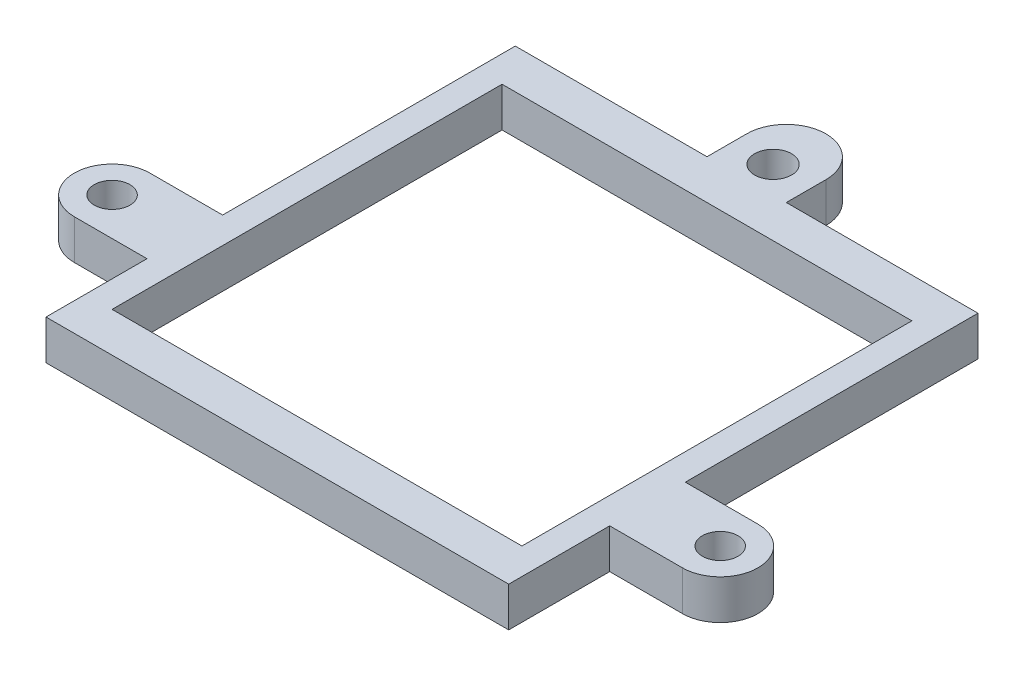
ISO-10303-21;
HEADER;
FILE_DESCRIPTION(('STEP AP214'),'2;1');
FILE_NAME('part.step','',(''),(''),'','','');
FILE_SCHEMA(('AUTOMOTIVE_DESIGN { 1 0 10303 214 1 1 1 1 }'));
ENDSEC;
DATA;
#1=APPLICATION_CONTEXT('core data for automotive mechanical design processes');
#2=APPLICATION_PROTOCOL_DEFINITION('international standard','automotive_design',2000,#1);
#3=PRODUCT_CONTEXT('',#1,'mechanical');
#4=PRODUCT('Part','Part','',(#3));
#5=PRODUCT_RELATED_PRODUCT_CATEGORY('part','',(#4));
#6=PRODUCT_DEFINITION_FORMATION('','',#4);
#7=PRODUCT_DEFINITION_CONTEXT('part definition',#1,'design');
#8=PRODUCT_DEFINITION('design','',#6,#7);
#9=PRODUCT_DEFINITION_SHAPE('','',#8);
#10=(LENGTH_UNIT() NAMED_UNIT(*) SI_UNIT(.MILLI.,.METRE.));
#11=(NAMED_UNIT(*) PLANE_ANGLE_UNIT() SI_UNIT($,.RADIAN.));
#12=(NAMED_UNIT(*) SI_UNIT($,.STERADIAN.) SOLID_ANGLE_UNIT());
#13=UNCERTAINTY_MEASURE_WITH_UNIT(LENGTH_MEASURE(1.E-05),#10,'distance_accuracy_value','');
#14=(GEOMETRIC_REPRESENTATION_CONTEXT(3) GLOBAL_UNCERTAINTY_ASSIGNED_CONTEXT((#13)) GLOBAL_UNIT_ASSIGNED_CONTEXT((#10,
#11,#12)) REPRESENTATION_CONTEXT('',''));
#15=CARTESIAN_POINT('',(0.,0.,0.));
#16=DIRECTION('',(0.,0.,1.));
#17=DIRECTION('',(1.,0.,0.));
#18=AXIS2_PLACEMENT_3D('',#15,#16,#17);
#19=CARTESIAN_POINT('',(0.,3.,-14.75));
#20=DIRECTION('',(0.,0.,-1.));
#21=DIRECTION('',(-1.,0.,0.));
#22=AXIS2_PLACEMENT_3D('',#19,#20,#21);
#23=PLANE('',#22);
#24=DIRECTION('',(1.,0.,0.));
#25=VECTOR('',#24,1.);
#26=CARTESIAN_POINT('',(0.,0.,-14.75));
#27=LINE('',#26,#25);
#28=CARTESIAN_POINT('',(-15.5,0.,-14.75));
#29=VERTEX_POINT('',#28);
#30=CARTESIAN_POINT('',(15.5,0.,-14.75));
#31=VERTEX_POINT('',#30);
#32=EDGE_CURVE('E257',#29,#31,#27,.T.);
#33=ORIENTED_EDGE('',*,*,#32,.T.);
#34=DIRECTION('',(0.,-1.,0.));
#35=VECTOR('',#34,1.);
#36=CARTESIAN_POINT('',(15.5,3.,-14.75));
#37=LINE('',#36,#35);
#38=CARTESIAN_POINT('',(15.5,3.,-14.75));
#39=VERTEX_POINT('',#38);
#40=EDGE_CURVE('E11',#39,#31,#37,.T.);
#41=ORIENTED_EDGE('',*,*,#40,.F.);
#42=DIRECTION('',(1.,0.,0.));
#43=VECTOR('',#42,1.);
#44=CARTESIAN_POINT('',(0.,3.,-14.75));
#45=LINE('',#44,#43);
#46=CARTESIAN_POINT('',(-15.5,3.,-14.75));
#47=VERTEX_POINT('',#46);
#48=EDGE_CURVE('E189',#47,#39,#45,.T.);
#49=ORIENTED_EDGE('',*,*,#48,.F.);
#50=DIRECTION('',(0.,-1.,0.));
#51=VECTOR('',#50,1.);
#52=CARTESIAN_POINT('',(-15.5,3.,-14.75));
#53=LINE('',#52,#51);
#54=EDGE_CURVE('E56',#47,#29,#53,.T.);
#55=ORIENTED_EDGE('',*,*,#54,.T.);
#56=EDGE_LOOP('',(#33,#41,#49,#55));
#57=FACE_BOUND('',#56,.T.);
#58=ADVANCED_FACE('F37',(#57),#23,.F.);
#59=CARTESIAN_POINT('',(15.5,3.,0.));
#60=DIRECTION('',(1.,0.,0.));
#61=DIRECTION('',(0.,0.,-1.));
#62=AXIS2_PLACEMENT_3D('',#59,#60,#61);
#63=PLANE('',#62);
#64=DIRECTION('',(0.,0.,1.));
#65=VECTOR('',#64,1.);
#66=CARTESIAN_POINT('',(15.5,0.,0.));
#67=LINE('',#66,#65);
#68=CARTESIAN_POINT('',(15.5,0.,14.75));
#69=VERTEX_POINT('',#68);
#70=EDGE_CURVE('E195',#31,#69,#67,.T.);
#71=ORIENTED_EDGE('',*,*,#70,.T.);
#72=DIRECTION('',(0.,-1.,0.));
#73=VECTOR('',#72,1.);
#74=CARTESIAN_POINT('',(15.5,3.,14.75));
#75=LINE('',#74,#73);
#76=CARTESIAN_POINT('',(15.5,3.,14.75));
#77=VERTEX_POINT('',#76);
#78=EDGE_CURVE('E47',#77,#69,#75,.T.);
#79=ORIENTED_EDGE('',*,*,#78,.F.);
#80=DIRECTION('',(0.,0.,1.));
#81=VECTOR('',#80,1.);
#82=CARTESIAN_POINT('',(15.5,3.,0.));
#83=LINE('',#82,#81);
#84=EDGE_CURVE('E182',#39,#77,#83,.T.);
#85=ORIENTED_EDGE('',*,*,#84,.F.);
#86=ORIENTED_EDGE('',*,*,#40,.T.);
#87=EDGE_LOOP('',(#71,#79,#85,#86));
#88=FACE_BOUND('',#87,.T.);
#89=ADVANCED_FACE('F194',(#88),#63,.F.);
#90=CARTESIAN_POINT('',(0.,3.,14.75));
#91=DIRECTION('',(0.,0.,-1.));
#92=DIRECTION('',(-1.,0.,0.));
#93=AXIS2_PLACEMENT_3D('',#90,#91,#92);
#94=PLANE('',#93);
#95=DIRECTION('',(1.,0.,0.));
#96=VECTOR('',#95,1.);
#97=CARTESIAN_POINT('',(0.,0.,14.75));
#98=LINE('',#97,#96);
#99=CARTESIAN_POINT('',(-15.5,0.,14.75));
#100=VERTEX_POINT('',#99);
#101=EDGE_CURVE('E260',#100,#69,#98,.T.);
#102=ORIENTED_EDGE('',*,*,#101,.F.);
#103=DIRECTION('',(0.,-1.,0.));
#104=VECTOR('',#103,1.);
#105=CARTESIAN_POINT('',(-15.5,3.,14.75));
#106=LINE('',#105,#104);
#107=CARTESIAN_POINT('',(-15.5,3.,14.75));
#108=VERTEX_POINT('',#107);
#109=EDGE_CURVE('E118',#108,#100,#106,.T.);
#110=ORIENTED_EDGE('',*,*,#109,.F.);
#111=DIRECTION('',(1.,0.,0.));
#112=VECTOR('',#111,1.);
#113=CARTESIAN_POINT('',(0.,3.,14.75));
#114=LINE('',#113,#112);
#115=EDGE_CURVE('E188',#108,#77,#114,.T.);
#116=ORIENTED_EDGE('',*,*,#115,.T.);
#117=ORIENTED_EDGE('',*,*,#78,.T.);
#118=EDGE_LOOP('',(#102,#110,#116,#117));
#119=FACE_BOUND('',#118,.T.);
#120=ADVANCED_FACE('F199',(#119),#94,.T.);
#121=CARTESIAN_POINT('',(-23.,3.,7.25));
#122=DIRECTION('',(0.,-1.,0.));
#123=DIRECTION('',(0.,0.,-1.));
#124=AXIS2_PLACEMENT_3D('',#121,#122,#123);
#125=CYLINDRICAL_SURFACE('',#124,2.86011574085284);
#126=CARTESIAN_POINT('',(-23.,0.,7.25));
#127=DIRECTION('',(0.,1.,0.));
#128=DIRECTION('',(0.,0.,1.));
#129=AXIS2_PLACEMENT_3D('',#126,#127,#128);
#130=CIRCLE('',#129,2.86011574085284);
#131=CARTESIAN_POINT('',(-23.,0.,10.1101157408528));
#132=VERTEX_POINT('',#131);
#133=CARTESIAN_POINT('',(-23.,0.,4.38988425914716));
#134=VERTEX_POINT('',#133);
#135=EDGE_CURVE('E215',#132,#134,#130,.F.);
#136=ORIENTED_EDGE('',*,*,#135,.F.);
#137=DIRECTION('',(0.,-1.,0.));
#138=VECTOR('',#137,1.);
#139=CARTESIAN_POINT('',(-23.,3.,10.1101157408528));
#140=LINE('',#139,#138);
#141=CARTESIAN_POINT('',(-23.,3.,10.1101157408528));
#142=VERTEX_POINT('',#141);
#143=EDGE_CURVE('E41',#142,#132,#140,.T.);
#144=ORIENTED_EDGE('',*,*,#143,.F.);
#145=CARTESIAN_POINT('',(-23.,3.,7.25));
#146=DIRECTION('',(0.,1.,0.));
#147=DIRECTION('',(0.,0.,1.));
#148=AXIS2_PLACEMENT_3D('',#145,#146,#147);
#149=CIRCLE('',#148,2.86011574085284);
#150=CARTESIAN_POINT('',(-23.,3.,4.38988425914716));
#151=VERTEX_POINT('',#150);
#152=EDGE_CURVE('E332',#142,#151,#149,.F.);
#153=ORIENTED_EDGE('',*,*,#152,.T.);
#154=DIRECTION('',(0.,-1.,0.));
#155=VECTOR('',#154,1.);
#156=CARTESIAN_POINT('',(-23.,3.,4.38988425914716));
#157=LINE('',#156,#155);
#158=EDGE_CURVE('E211',#151,#134,#157,.T.);
#159=ORIENTED_EDGE('',*,*,#158,.T.);
#160=EDGE_LOOP('',(#136,#144,#153,#159));
#161=FACE_BOUND('',#160,.T.);
#162=ADVANCED_FACE('F312',(#161),#125,.T.);
#163=CARTESIAN_POINT('',(0.,3.,10.1101157408528));
#164=DIRECTION('',(0.,0.,1.));
#165=DIRECTION('',(1.,0.,0.));
#166=AXIS2_PLACEMENT_3D('',#163,#164,#165);
#167=PLANE('',#166);
#168=DIRECTION('',(-1.,0.,0.));
#169=VECTOR('',#168,1.);
#170=CARTESIAN_POINT('',(0.,0.,10.1101157408528));
#171=LINE('',#170,#169);
#172=CARTESIAN_POINT('',(-17.5,0.,10.1101157408528));
#173=VERTEX_POINT('',#172);
#174=EDGE_CURVE('E218',#173,#132,#171,.T.);
#175=ORIENTED_EDGE('',*,*,#174,.F.);
#176=DIRECTION('',(0.,-1.,0.));
#177=VECTOR('',#176,1.);
#178=CARTESIAN_POINT('',(-17.5,3.,10.1101157408528));
#179=LINE('',#178,#177);
#180=CARTESIAN_POINT('',(-17.5,3.,10.1101157408528));
#181=VERTEX_POINT('',#180);
#182=EDGE_CURVE('E302',#181,#173,#179,.T.);
#183=ORIENTED_EDGE('',*,*,#182,.F.);
#184=DIRECTION('',(-1.,0.,0.));
#185=VECTOR('',#184,1.);
#186=CARTESIAN_POINT('',(0.,3.,10.1101157408528));
#187=LINE('',#186,#185);
#188=EDGE_CURVE('E311',#181,#142,#187,.T.);
#189=ORIENTED_EDGE('',*,*,#188,.T.);
#190=ORIENTED_EDGE('',*,*,#143,.T.);
#191=EDGE_LOOP('',(#175,#183,#189,#190));
#192=FACE_BOUND('',#191,.T.);
#193=ADVANCED_FACE('F309',(#192),#167,.T.);
#194=CARTESIAN_POINT('',(-17.5,3.,0.));
#195=DIRECTION('',(1.,0.,0.));
#196=DIRECTION('',(0.,0.,-1.));
#197=AXIS2_PLACEMENT_3D('',#194,#195,#196);
#198=PLANE('',#197);
#199=DIRECTION('',(0.,0.,1.));
#200=VECTOR('',#199,1.);
#201=CARTESIAN_POINT('',(-17.5,0.,0.));
#202=LINE('',#201,#200);
#203=CARTESIAN_POINT('',(-17.5,0.,17.75));
#204=VERTEX_POINT('',#203);
#205=EDGE_CURVE('E221',#173,#204,#202,.T.);
#206=ORIENTED_EDGE('',*,*,#205,.T.);
#207=DIRECTION('',(0.,-1.,0.));
#208=VECTOR('',#207,1.);
#209=CARTESIAN_POINT('',(-17.5,3.,17.75));
#210=LINE('',#209,#208);
#211=CARTESIAN_POINT('',(-17.5,3.,17.75));
#212=VERTEX_POINT('',#211);
#213=EDGE_CURVE('E300',#212,#204,#210,.T.);
#214=ORIENTED_EDGE('',*,*,#213,.F.);
#215=DIRECTION('',(0.,0.,1.));
#216=VECTOR('',#215,1.);
#217=CARTESIAN_POINT('',(-17.5,3.,0.));
#218=LINE('',#217,#216);
#219=EDGE_CURVE('E320',#181,#212,#218,.T.);
#220=ORIENTED_EDGE('',*,*,#219,.F.);
#221=ORIENTED_EDGE('',*,*,#182,.T.);
#222=EDGE_LOOP('',(#206,#214,#220,#221));
#223=FACE_BOUND('',#222,.T.);
#224=ADVANCED_FACE('F318',(#223),#198,.F.);
#225=CARTESIAN_POINT('',(0.,3.,17.75));
#226=DIRECTION('',(0.,0.,-1.));
#227=DIRECTION('',(-1.,0.,0.));
#228=AXIS2_PLACEMENT_3D('',#225,#226,#227);
#229=PLANE('',#228);
#230=DIRECTION('',(1.,0.,0.));
#231=VECTOR('',#230,1.);
#232=CARTESIAN_POINT('',(0.,0.,17.75));
#233=LINE('',#232,#231);
#234=CARTESIAN_POINT('',(17.5,0.,17.75));
#235=VERTEX_POINT('',#234);
#236=EDGE_CURVE('E224',#204,#235,#233,.T.);
#237=ORIENTED_EDGE('',*,*,#236,.T.);
#238=DIRECTION('',(0.,-1.,0.));
#239=VECTOR('',#238,1.);
#240=CARTESIAN_POINT('',(17.5,3.,17.75));
#241=LINE('',#240,#239);
#242=CARTESIAN_POINT('',(17.5,3.,17.75));
#243=VERTEX_POINT('',#242);
#244=EDGE_CURVE('E298',#243,#235,#241,.T.);
#245=ORIENTED_EDGE('',*,*,#244,.F.);
#246=DIRECTION('',(1.,0.,0.));
#247=VECTOR('',#246,1.);
#248=CARTESIAN_POINT('',(0.,3.,17.75));
#249=LINE('',#248,#247);
#250=EDGE_CURVE('E324',#212,#243,#249,.T.);
#251=ORIENTED_EDGE('',*,*,#250,.F.);
#252=ORIENTED_EDGE('',*,*,#213,.T.);
#253=EDGE_LOOP('',(#237,#245,#251,#252));
#254=FACE_BOUND('',#253,.T.);
#255=ADVANCED_FACE('F322',(#254),#229,.F.);
#256=CARTESIAN_POINT('',(17.5,3.,0.));
#257=DIRECTION('',(1.,0.,0.));
#258=DIRECTION('',(0.,0.,-1.));
#259=AXIS2_PLACEMENT_3D('',#256,#257,#258);
#260=PLANE('',#259);
#261=DIRECTION('',(0.,0.,1.));
#262=VECTOR('',#261,1.);
#263=CARTESIAN_POINT('',(17.5,0.,0.));
#264=LINE('',#263,#262);
#265=CARTESIAN_POINT('',(17.5,0.,10.1101157408528));
#266=VERTEX_POINT('',#265);
#267=EDGE_CURVE('E228',#266,#235,#264,.T.);
#268=ORIENTED_EDGE('',*,*,#267,.F.);
#269=DIRECTION('',(0.,-1.,0.));
#270=VECTOR('',#269,1.);
#271=CARTESIAN_POINT('',(17.5,3.,10.1101157408528));
#272=LINE('',#271,#270);
#273=CARTESIAN_POINT('',(17.5,3.,10.1101157408528));
#274=VERTEX_POINT('',#273);
#275=EDGE_CURVE('E296',#274,#266,#272,.T.);
#276=ORIENTED_EDGE('',*,*,#275,.F.);
#277=DIRECTION('',(0.,0.,1.));
#278=VECTOR('',#277,1.);
#279=CARTESIAN_POINT('',(17.5,3.,0.));
#280=LINE('',#279,#278);
#281=EDGE_CURVE('E328',#274,#243,#280,.T.);
#282=ORIENTED_EDGE('',*,*,#281,.T.);
#283=ORIENTED_EDGE('',*,*,#244,.T.);
#284=EDGE_LOOP('',(#268,#276,#282,#283));
#285=FACE_BOUND('',#284,.T.);
#286=ADVANCED_FACE('F449',(#285),#260,.T.);
#287=CARTESIAN_POINT('',(0.,3.,10.1101157408528));
#288=DIRECTION('',(0.,0.,-1.));
#289=DIRECTION('',(-1.,0.,0.));
#290=AXIS2_PLACEMENT_3D('',#287,#288,#289);
#291=PLANE('',#290);
#292=DIRECTION('',(1.,0.,0.));
#293=VECTOR('',#292,1.);
#294=CARTESIAN_POINT('',(0.,0.,10.1101157408528));
#295=LINE('',#294,#293);
#296=CARTESIAN_POINT('',(23.,0.,10.1101157408528));
#297=VERTEX_POINT('',#296);
#298=EDGE_CURVE('E231',#266,#297,#295,.T.);
#299=ORIENTED_EDGE('',*,*,#298,.T.);
#300=DIRECTION('',(0.,-1.,0.));
#301=VECTOR('',#300,1.);
#302=CARTESIAN_POINT('',(23.,3.,10.1101157408528));
#303=LINE('',#302,#301);
#304=CARTESIAN_POINT('',(23.,3.,10.1101157408528));
#305=VERTEX_POINT('',#304);
#306=EDGE_CURVE('E294',#305,#297,#303,.T.);
#307=ORIENTED_EDGE('',*,*,#306,.F.);
#308=DIRECTION('',(1.,0.,0.));
#309=VECTOR('',#308,1.);
#310=CARTESIAN_POINT('',(0.,3.,10.1101157408528));
#311=LINE('',#310,#309);
#312=EDGE_CURVE('E364',#274,#305,#311,.T.);
#313=ORIENTED_EDGE('',*,*,#312,.F.);
#314=ORIENTED_EDGE('',*,*,#275,.T.);
#315=EDGE_LOOP('',(#299,#307,#313,#314));
#316=FACE_BOUND('',#315,.T.);
#317=ADVANCED_FACE('F454',(#316),#291,.F.);
#318=CARTESIAN_POINT('',(23.,3.,7.25));
#319=DIRECTION('',(0.,-1.,0.));
#320=DIRECTION('',(0.,0.,-1.));
#321=AXIS2_PLACEMENT_3D('',#318,#319,#320);
#322=CYLINDRICAL_SURFACE('',#321,2.86011574085284);
#323=CARTESIAN_POINT('',(23.,0.,7.25));
#324=DIRECTION('',(0.,1.,0.));
#325=DIRECTION('',(0.,0.,1.));
#326=AXIS2_PLACEMENT_3D('',#323,#324,#325);
#327=CIRCLE('',#326,2.86011574085284);
#328=CARTESIAN_POINT('',(23.,0.,4.38988425914716));
#329=VERTEX_POINT('',#328);
#330=EDGE_CURVE('E235',#329,#297,#327,.F.);
#331=ORIENTED_EDGE('',*,*,#330,.F.);
#332=DIRECTION('',(0.,-1.,0.));
#333=VECTOR('',#332,1.);
#334=CARTESIAN_POINT('',(23.,3.,4.38988425914716));
#335=LINE('',#334,#333);
#336=CARTESIAN_POINT('',(23.,3.,4.38988425914716));
#337=VERTEX_POINT('',#336);
#338=EDGE_CURVE('E292',#337,#329,#335,.T.);
#339=ORIENTED_EDGE('',*,*,#338,.F.);
#340=CARTESIAN_POINT('',(23.,3.,7.25));
#341=DIRECTION('',(0.,1.,0.));
#342=DIRECTION('',(0.,0.,1.));
#343=AXIS2_PLACEMENT_3D('',#340,#341,#342);
#344=CIRCLE('',#343,2.86011574085284);
#345=EDGE_CURVE('E362',#337,#305,#344,.F.);
#346=ORIENTED_EDGE('',*,*,#345,.T.);
#347=ORIENTED_EDGE('',*,*,#306,.T.);
#348=EDGE_LOOP('',(#331,#339,#346,#347));
#349=FACE_BOUND('',#348,.T.);
#350=ADVANCED_FACE('F373',(#349),#322,.T.);
#351=CARTESIAN_POINT('',(0.,3.,4.38988425914716));
#352=DIRECTION('',(0.,0.,-1.));
#353=DIRECTION('',(-1.,0.,0.));
#354=AXIS2_PLACEMENT_3D('',#351,#352,#353);
#355=PLANE('',#354);
#356=DIRECTION('',(1.,0.,0.));
#357=VECTOR('',#356,1.);
#358=CARTESIAN_POINT('',(0.,0.,4.38988425914716));
#359=LINE('',#358,#357);
#360=CARTESIAN_POINT('',(17.5,0.,4.38988425914716));
#361=VERTEX_POINT('',#360);
#362=EDGE_CURVE('E238',#361,#329,#359,.T.);
#363=ORIENTED_EDGE('',*,*,#362,.F.);
#364=DIRECTION('',(0.,-1.,0.));
#365=VECTOR('',#364,1.);
#366=CARTESIAN_POINT('',(17.5,3.,4.38988425914716));
#367=LINE('',#366,#365);
#368=CARTESIAN_POINT('',(17.5,3.,4.38988425914716));
#369=VERTEX_POINT('',#368);
#370=EDGE_CURVE('E290',#369,#361,#367,.T.);
#371=ORIENTED_EDGE('',*,*,#370,.F.);
#372=DIRECTION('',(1.,0.,0.));
#373=VECTOR('',#372,1.);
#374=CARTESIAN_POINT('',(0.,3.,4.38988425914716));
#375=LINE('',#374,#373);
#376=EDGE_CURVE('E357',#369,#337,#375,.T.);
#377=ORIENTED_EDGE('',*,*,#376,.T.);
#378=ORIENTED_EDGE('',*,*,#338,.T.);
#379=EDGE_LOOP('',(#363,#371,#377,#378));
#380=FACE_BOUND('',#379,.T.);
#381=ADVANCED_FACE('F377',(#380),#355,.T.);
#382=CARTESIAN_POINT('',(17.5,0.,-17.75));
#383=VERTEX_POINT('',#382);
#384=EDGE_CURVE('E232',#383,#361,#264,.T.);
#385=ORIENTED_EDGE('',*,*,#384,.F.);
#386=DIRECTION('',(0.,-1.,0.));
#387=VECTOR('',#386,1.);
#388=CARTESIAN_POINT('',(17.5,3.,-17.75));
#389=LINE('',#388,#387);
#390=CARTESIAN_POINT('',(17.5,3.,-17.75));
#391=VERTEX_POINT('',#390);
#392=EDGE_CURVE('E288',#391,#383,#389,.T.);
#393=ORIENTED_EDGE('',*,*,#392,.F.);
#394=EDGE_CURVE('E353',#391,#369,#280,.T.);
#395=ORIENTED_EDGE('',*,*,#394,.T.);
#396=ORIENTED_EDGE('',*,*,#370,.T.);
#397=EDGE_LOOP('',(#385,#393,#395,#396));
#398=FACE_BOUND('',#397,.T.);
#399=ADVANCED_FACE('F380',(#398),#260,.T.);
#400=CARTESIAN_POINT('',(0.,3.,-17.75));
#401=DIRECTION('',(0.,0.,-1.));
#402=DIRECTION('',(-1.,0.,0.));
#403=AXIS2_PLACEMENT_3D('',#400,#401,#402);
#404=PLANE('',#403);
#405=DIRECTION('',(1.,0.,0.));
#406=VECTOR('',#405,1.);
#407=CARTESIAN_POINT('',(0.,0.,-17.75));
#408=LINE('',#407,#406);
#409=CARTESIAN_POINT('',(3.,0.,-17.75));
#410=VERTEX_POINT('',#409);
#411=EDGE_CURVE('E241',#410,#383,#408,.T.);
#412=ORIENTED_EDGE('',*,*,#411,.F.);
#413=DIRECTION('',(0.,-1.,0.));
#414=VECTOR('',#413,1.);
#415=CARTESIAN_POINT('',(3.,3.,-17.75));
#416=LINE('',#415,#414);
#417=CARTESIAN_POINT('',(3.,3.,-17.75));
#418=VERTEX_POINT('',#417);
#419=EDGE_CURVE('E286',#418,#410,#416,.T.);
#420=ORIENTED_EDGE('',*,*,#419,.F.);
#421=DIRECTION('',(1.,0.,0.));
#422=VECTOR('',#421,1.);
#423=CARTESIAN_POINT('',(0.,3.,-17.75));
#424=LINE('',#423,#422);
#425=EDGE_CURVE('E344',#418,#391,#424,.T.);
#426=ORIENTED_EDGE('',*,*,#425,.T.);
#427=ORIENTED_EDGE('',*,*,#392,.T.);
#428=EDGE_LOOP('',(#412,#420,#426,#427));
#429=FACE_BOUND('',#428,.T.);
#430=ADVANCED_FACE('F383',(#429),#404,.T.);
#431=CARTESIAN_POINT('',(2.99999999999999,3.,0.));
#432=DIRECTION('',(-1.,0.,0.));
#433=DIRECTION('',(0.,0.,1.));
#434=AXIS2_PLACEMENT_3D('',#431,#432,#433);
#435=PLANE('',#434);
#436=DIRECTION('',(0.,0.,-1.));
#437=VECTOR('',#436,1.);
#438=CARTESIAN_POINT('',(2.99999999999999,0.,0.));
#439=LINE('',#438,#437);
#440=CARTESIAN_POINT('',(3.,0.,-20.75));
#441=VERTEX_POINT('',#440);
#442=EDGE_CURVE('E244',#410,#441,#439,.T.);
#443=ORIENTED_EDGE('',*,*,#442,.T.);
#444=DIRECTION('',(0.,-1.,0.));
#445=VECTOR('',#444,1.);
#446=CARTESIAN_POINT('',(3.,3.,-20.75));
#447=LINE('',#446,#445);
#448=CARTESIAN_POINT('',(3.,3.,-20.75));
#449=VERTEX_POINT('',#448);
#450=EDGE_CURVE('E284',#449,#441,#447,.T.);
#451=ORIENTED_EDGE('',*,*,#450,.F.);
#452=DIRECTION('',(0.,0.,-1.));
#453=VECTOR('',#452,1.);
#454=CARTESIAN_POINT('',(2.99999999999999,3.,0.));
#455=LINE('',#454,#453);
#456=EDGE_CURVE('E352',#418,#449,#455,.T.);
#457=ORIENTED_EDGE('',*,*,#456,.F.);
#458=ORIENTED_EDGE('',*,*,#419,.T.);
#459=EDGE_LOOP('',(#443,#451,#457,#458));
#460=FACE_BOUND('',#459,.T.);
#461=ADVANCED_FACE('F387',(#460),#435,.F.);
#462=CARTESIAN_POINT('',(0.,3.,-20.75));
#463=DIRECTION('',(0.,-1.,0.));
#464=DIRECTION('',(0.,0.,-1.));
#465=AXIS2_PLACEMENT_3D('',#462,#463,#464);
#466=CYLINDRICAL_SURFACE('',#465,3.);
#467=CARTESIAN_POINT('',(0.,0.,-20.75));
#468=DIRECTION('',(0.,1.,0.));
#469=DIRECTION('',(0.,0.,1.));
#470=AXIS2_PLACEMENT_3D('',#467,#468,#469);
#471=CIRCLE('',#470,3.);
#472=CARTESIAN_POINT('',(-3.,0.,-20.75));
#473=VERTEX_POINT('',#472);
#474=EDGE_CURVE('E248',#473,#441,#471,.F.);
#475=ORIENTED_EDGE('',*,*,#474,.F.);
#476=DIRECTION('',(0.,-1.,0.));
#477=VECTOR('',#476,1.);
#478=CARTESIAN_POINT('',(-3.,3.,-20.75));
#479=LINE('',#478,#477);
#480=CARTESIAN_POINT('',(-3.,3.,-20.75));
#481=VERTEX_POINT('',#480);
#482=EDGE_CURVE('E282',#481,#473,#479,.T.);
#483=ORIENTED_EDGE('',*,*,#482,.F.);
#484=CARTESIAN_POINT('',(0.,3.,-20.75));
#485=DIRECTION('',(0.,1.,0.));
#486=DIRECTION('',(0.,0.,1.));
#487=AXIS2_PLACEMENT_3D('',#484,#485,#486);
#488=CIRCLE('',#487,3.);
#489=EDGE_CURVE('E347',#481,#449,#488,.F.);
#490=ORIENTED_EDGE('',*,*,#489,.T.);
#491=ORIENTED_EDGE('',*,*,#450,.T.);
#492=EDGE_LOOP('',(#475,#483,#490,#491));
#493=FACE_BOUND('',#492,.T.);
#494=ADVANCED_FACE('F442',(#493),#466,.T.);
#495=CARTESIAN_POINT('',(-2.99999999999999,3.,0.));
#496=DIRECTION('',(-1.,0.,0.));
#497=DIRECTION('',(0.,0.,1.));
#498=AXIS2_PLACEMENT_3D('',#495,#496,#497);
#499=PLANE('',#498);
#500=DIRECTION('',(0.,0.,-1.));
#501=VECTOR('',#500,1.);
#502=CARTESIAN_POINT('',(-2.99999999999999,0.,0.));
#503=LINE('',#502,#501);
#504=CARTESIAN_POINT('',(-3.,0.,-17.75));
#505=VERTEX_POINT('',#504);
#506=EDGE_CURVE('E251',#505,#473,#503,.T.);
#507=ORIENTED_EDGE('',*,*,#506,.F.);
#508=DIRECTION('',(0.,-1.,0.));
#509=VECTOR('',#508,1.);
#510=CARTESIAN_POINT('',(-3.,3.,-17.75));
#511=LINE('',#510,#509);
#512=CARTESIAN_POINT('',(-3.,3.,-17.75));
#513=VERTEX_POINT('',#512);
#514=EDGE_CURVE('E280',#513,#505,#511,.T.);
#515=ORIENTED_EDGE('',*,*,#514,.F.);
#516=DIRECTION('',(0.,0.,-1.));
#517=VECTOR('',#516,1.);
#518=CARTESIAN_POINT('',(-2.99999999999999,3.,0.));
#519=LINE('',#518,#517);
#520=EDGE_CURVE('E342',#513,#481,#519,.T.);
#521=ORIENTED_EDGE('',*,*,#520,.T.);
#522=ORIENTED_EDGE('',*,*,#482,.T.);
#523=EDGE_LOOP('',(#507,#515,#521,#522));
#524=FACE_BOUND('',#523,.T.);
#525=ADVANCED_FACE('F395',(#524),#499,.T.);
#526=CARTESIAN_POINT('',(-17.5,0.,-17.75));
#527=VERTEX_POINT('',#526);
#528=EDGE_CURVE('E245',#527,#505,#408,.T.);
#529=ORIENTED_EDGE('',*,*,#528,.F.);
#530=DIRECTION('',(0.,-1.,0.));
#531=VECTOR('',#530,1.);
#532=CARTESIAN_POINT('',(-17.5,3.,-17.75));
#533=LINE('',#532,#531);
#534=CARTESIAN_POINT('',(-17.5,3.,-17.75));
#535=VERTEX_POINT('',#534);
#536=EDGE_CURVE('E278',#535,#527,#533,.T.);
#537=ORIENTED_EDGE('',*,*,#536,.F.);
#538=EDGE_CURVE('E336',#535,#513,#424,.T.);
#539=ORIENTED_EDGE('',*,*,#538,.T.);
#540=ORIENTED_EDGE('',*,*,#514,.T.);
#541=EDGE_LOOP('',(#529,#537,#539,#540));
#542=FACE_BOUND('',#541,.T.);
#543=ADVANCED_FACE('F399',(#542),#404,.T.);
#544=CARTESIAN_POINT('',(-17.5,0.,4.38988425914716));
#545=VERTEX_POINT('',#544);
#546=EDGE_CURVE('E225',#527,#545,#202,.T.);
#547=ORIENTED_EDGE('',*,*,#546,.T.);
#548=DIRECTION('',(0.,-1.,0.));
#549=VECTOR('',#548,1.);
#550=CARTESIAN_POINT('',(-17.5,3.,4.38988425914716));
#551=LINE('',#550,#549);
#552=CARTESIAN_POINT('',(-17.5,3.,4.38988425914716));
#553=VERTEX_POINT('',#552);
#554=EDGE_CURVE('E275',#553,#545,#551,.T.);
#555=ORIENTED_EDGE('',*,*,#554,.F.);
#556=EDGE_CURVE('E331',#535,#553,#218,.T.);
#557=ORIENTED_EDGE('',*,*,#556,.F.);
#558=ORIENTED_EDGE('',*,*,#536,.T.);
#559=EDGE_LOOP('',(#547,#555,#557,#558));
#560=FACE_BOUND('',#559,.T.);
#561=ADVANCED_FACE('F403',(#560),#198,.F.);
#562=CARTESIAN_POINT('',(0.,3.,-19.75));
#563=DIRECTION('',(0.,-1.,0.));
#564=DIRECTION('',(0.,0.,-1.));
#565=AXIS2_PLACEMENT_3D('',#562,#563,#564);
#566=CYLINDRICAL_SURFACE('',#565,1.4);
#567=CARTESIAN_POINT('',(0.,3.,-19.75));
#568=DIRECTION('',(0.,1.,0.));
#569=DIRECTION('',(0.,0.,1.));
#570=AXIS2_PLACEMENT_3D('',#567,#568,#569);
#571=CIRCLE('',#570,1.4);
#572=CARTESIAN_POINT('',(0.,3.,-18.35));
#573=VERTEX_POINT('',#572);
#574=EDGE_CURVE('E202',#573,#573,#571,.T.);
#575=ORIENTED_EDGE('',*,*,#574,.T.);
#576=EDGE_LOOP('',(#575));
#577=FACE_BOUND('',#576,.T.);
#578=CARTESIAN_POINT('',(0.,0.,-19.75));
#579=DIRECTION('',(0.,1.,0.));
#580=DIRECTION('',(0.,0.,1.));
#581=AXIS2_PLACEMENT_3D('',#578,#579,#580);
#582=CIRCLE('',#581,1.4);
#583=CARTESIAN_POINT('',(0.,0.,-18.35));
#584=VERTEX_POINT('',#583);
#585=EDGE_CURVE('E265',#584,#584,#582,.T.);
#586=ORIENTED_EDGE('',*,*,#585,.F.);
#587=EDGE_LOOP('',(#586));
#588=FACE_BOUND('',#587,.T.);
#589=ADVANCED_FACE('F437',(#577,#588),#566,.F.);
#590=CARTESIAN_POINT('',(-15.5,3.,0.));
#591=DIRECTION('',(1.,0.,0.));
#592=DIRECTION('',(0.,0.,-1.));
#593=AXIS2_PLACEMENT_3D('',#590,#591,#592);
#594=PLANE('',#593);
#595=DIRECTION('',(0.,0.,1.));
#596=VECTOR('',#595,1.);
#597=CARTESIAN_POINT('',(-15.5,0.,0.));
#598=LINE('',#597,#596);
#599=EDGE_CURVE('E262',#29,#100,#598,.T.);
#600=ORIENTED_EDGE('',*,*,#599,.F.);
#601=ORIENTED_EDGE('',*,*,#54,.F.);
#602=DIRECTION('',(0.,0.,1.));
#603=VECTOR('',#602,1.);
#604=CARTESIAN_POINT('',(-15.5,3.,0.));
#605=LINE('',#604,#603);
#606=EDGE_CURVE('E200',#47,#108,#605,.T.);
#607=ORIENTED_EDGE('',*,*,#606,.T.);
#608=ORIENTED_EDGE('',*,*,#109,.T.);
#609=EDGE_LOOP('',(#600,#601,#607,#608));
#610=FACE_BOUND('',#609,.T.);
#611=ADVANCED_FACE('F434',(#610),#594,.T.);
#612=CARTESIAN_POINT('',(0.,3.,4.38988425914716));
#613=DIRECTION('',(0.,0.,1.));
#614=DIRECTION('',(1.,0.,0.));
#615=AXIS2_PLACEMENT_3D('',#612,#613,#614);
#616=PLANE('',#615);
#617=DIRECTION('',(-1.,0.,0.));
#618=VECTOR('',#617,1.);
#619=CARTESIAN_POINT('',(0.,0.,4.38988425914716));
#620=LINE('',#619,#618);
#621=EDGE_CURVE('E254',#545,#134,#620,.T.);
#622=ORIENTED_EDGE('',*,*,#621,.T.);
#623=ORIENTED_EDGE('',*,*,#158,.F.);
#624=DIRECTION('',(-1.,0.,0.));
#625=VECTOR('',#624,1.);
#626=CARTESIAN_POINT('',(0.,3.,4.38988425914716));
#627=LINE('',#626,#625);
#628=EDGE_CURVE('E335',#553,#151,#627,.T.);
#629=ORIENTED_EDGE('',*,*,#628,.F.);
#630=ORIENTED_EDGE('',*,*,#554,.T.);
#631=EDGE_LOOP('',(#622,#623,#629,#630));
#632=FACE_BOUND('',#631,.T.);
#633=ADVANCED_FACE('F405',(#632),#616,.F.);
#634=CARTESIAN_POINT('',(-23.,3.,7.25));
#635=DIRECTION('',(0.,-1.,0.));
#636=DIRECTION('',(0.,0.,-1.));
#637=AXIS2_PLACEMENT_3D('',#634,#635,#636);
#638=CYLINDRICAL_SURFACE('',#637,1.35);
#639=CARTESIAN_POINT('',(-23.,3.,7.25));
#640=DIRECTION('',(0.,1.,0.));
#641=DIRECTION('',(0.,0.,1.));
#642=AXIS2_PLACEMENT_3D('',#639,#640,#641);
#643=CIRCLE('',#642,1.35);
#644=CARTESIAN_POINT('',(-23.,3.,8.6));
#645=VERTEX_POINT('',#644);
#646=EDGE_CURVE('E271',#645,#645,#643,.T.);
#647=ORIENTED_EDGE('',*,*,#646,.T.);
#648=EDGE_LOOP('',(#647));
#649=FACE_BOUND('',#648,.T.);
#650=CARTESIAN_POINT('',(-23.,0.,7.25));
#651=DIRECTION('',(0.,1.,0.));
#652=DIRECTION('',(0.,0.,1.));
#653=AXIS2_PLACEMENT_3D('',#650,#651,#652);
#654=CIRCLE('',#653,1.35);
#655=CARTESIAN_POINT('',(-23.,0.,8.6));
#656=VERTEX_POINT('',#655);
#657=EDGE_CURVE('E212',#656,#656,#654,.T.);
#658=ORIENTED_EDGE('',*,*,#657,.F.);
#659=EDGE_LOOP('',(#658));
#660=FACE_BOUND('',#659,.T.);
#661=ADVANCED_FACE('F39',(#649,#660),#638,.F.);
#662=CARTESIAN_POINT('',(23.,3.,7.25));
#663=DIRECTION('',(0.,-1.,0.));
#664=DIRECTION('',(0.,0.,-1.));
#665=AXIS2_PLACEMENT_3D('',#662,#663,#664);
#666=CYLINDRICAL_SURFACE('',#665,1.35);
#667=CARTESIAN_POINT('',(23.,3.,7.25));
#668=DIRECTION('',(0.,1.,0.));
#669=DIRECTION('',(0.,0.,1.));
#670=AXIS2_PLACEMENT_3D('',#667,#668,#669);
#671=CIRCLE('',#670,1.35);
#672=CARTESIAN_POINT('',(23.,3.,8.6));
#673=VERTEX_POINT('',#672);
#674=EDGE_CURVE('E208',#673,#673,#671,.T.);
#675=ORIENTED_EDGE('',*,*,#674,.T.);
#676=EDGE_LOOP('',(#675));
#677=FACE_BOUND('',#676,.T.);
#678=CARTESIAN_POINT('',(23.,0.,7.25));
#679=DIRECTION('',(0.,1.,0.));
#680=DIRECTION('',(0.,0.,1.));
#681=AXIS2_PLACEMENT_3D('',#678,#679,#680);
#682=CIRCLE('',#681,1.35);
#683=CARTESIAN_POINT('',(23.,0.,8.6));
#684=VERTEX_POINT('',#683);
#685=EDGE_CURVE('E268',#684,#684,#682,.T.);
#686=ORIENTED_EDGE('',*,*,#685,.F.);
#687=EDGE_LOOP('',(#686));
#688=FACE_BOUND('',#687,.T.);
#689=ADVANCED_FACE('F414',(#677,#688),#666,.F.);
#690=CARTESIAN_POINT('',(0.,3.,0.));
#691=DIRECTION('',(0.,1.,0.));
#692=DIRECTION('',(0.,0.,1.));
#693=AXIS2_PLACEMENT_3D('',#690,#691,#692);
#694=PLANE('',#693);
#695=ORIENTED_EDGE('',*,*,#646,.F.);
#696=EDGE_LOOP('',(#695));
#697=FACE_BOUND('',#696,.T.);
#698=ORIENTED_EDGE('',*,*,#152,.F.);
#699=ORIENTED_EDGE('',*,*,#188,.F.);
#700=ORIENTED_EDGE('',*,*,#219,.T.);
#701=ORIENTED_EDGE('',*,*,#250,.T.);
#702=ORIENTED_EDGE('',*,*,#281,.F.);
#703=ORIENTED_EDGE('',*,*,#312,.T.);
#704=ORIENTED_EDGE('',*,*,#345,.F.);
#705=ORIENTED_EDGE('',*,*,#376,.F.);
#706=ORIENTED_EDGE('',*,*,#394,.F.);
#707=ORIENTED_EDGE('',*,*,#425,.F.);
#708=ORIENTED_EDGE('',*,*,#456,.T.);
#709=ORIENTED_EDGE('',*,*,#489,.F.);
#710=ORIENTED_EDGE('',*,*,#520,.F.);
#711=ORIENTED_EDGE('',*,*,#538,.F.);
#712=ORIENTED_EDGE('',*,*,#556,.T.);
#713=ORIENTED_EDGE('',*,*,#628,.T.);
#714=EDGE_LOOP('',(#698,#699,#700,#701,#702,#703,#704,#705,#706,#707,#708,#709,#710,#711,#712,#713));
#715=FACE_BOUND('',#714,.T.);
#716=ORIENTED_EDGE('',*,*,#48,.T.);
#717=ORIENTED_EDGE('',*,*,#84,.T.);
#718=ORIENTED_EDGE('',*,*,#115,.F.);
#719=ORIENTED_EDGE('',*,*,#606,.F.);
#720=EDGE_LOOP('',(#716,#717,#718,#719));
#721=FACE_BOUND('',#720,.T.);
#722=ORIENTED_EDGE('',*,*,#574,.F.);
#723=EDGE_LOOP('',(#722));
#724=FACE_BOUND('',#723,.T.);
#725=ORIENTED_EDGE('',*,*,#674,.F.);
#726=EDGE_LOOP('',(#725));
#727=FACE_BOUND('',#726,.T.);
#728=ADVANCED_FACE('F184',(#697,#715,#721,#724,#727),#694,.T.);
#729=CARTESIAN_POINT('',(0.,0.,0.));
#730=DIRECTION('',(0.,1.,0.));
#731=DIRECTION('',(0.,0.,1.));
#732=AXIS2_PLACEMENT_3D('',#729,#730,#731);
#733=PLANE('',#732);
#734=ORIENTED_EDGE('',*,*,#657,.T.);
#735=EDGE_LOOP('',(#734));
#736=FACE_BOUND('',#735,.T.);
#737=ORIENTED_EDGE('',*,*,#135,.T.);
#738=ORIENTED_EDGE('',*,*,#621,.F.);
#739=ORIENTED_EDGE('',*,*,#546,.F.);
#740=ORIENTED_EDGE('',*,*,#528,.T.);
#741=ORIENTED_EDGE('',*,*,#506,.T.);
#742=ORIENTED_EDGE('',*,*,#474,.T.);
#743=ORIENTED_EDGE('',*,*,#442,.F.);
#744=ORIENTED_EDGE('',*,*,#411,.T.);
#745=ORIENTED_EDGE('',*,*,#384,.T.);
#746=ORIENTED_EDGE('',*,*,#362,.T.);
#747=ORIENTED_EDGE('',*,*,#330,.T.);
#748=ORIENTED_EDGE('',*,*,#298,.F.);
#749=ORIENTED_EDGE('',*,*,#267,.T.);
#750=ORIENTED_EDGE('',*,*,#236,.F.);
#751=ORIENTED_EDGE('',*,*,#205,.F.);
#752=ORIENTED_EDGE('',*,*,#174,.T.);
#753=EDGE_LOOP('',(#737,#738,#739,#740,#741,#742,#743,#744,#745,#746,#747,#748,#749,#750,#751,#752));
#754=FACE_BOUND('',#753,.T.);
#755=ORIENTED_EDGE('',*,*,#32,.F.);
#756=ORIENTED_EDGE('',*,*,#599,.T.);
#757=ORIENTED_EDGE('',*,*,#101,.T.);
#758=ORIENTED_EDGE('',*,*,#70,.F.);
#759=EDGE_LOOP('',(#755,#756,#757,#758));
#760=FACE_BOUND('',#759,.T.);
#761=ORIENTED_EDGE('',*,*,#585,.T.);
#762=EDGE_LOOP('',(#761));
#763=FACE_BOUND('',#762,.T.);
#764=ORIENTED_EDGE('',*,*,#685,.T.);
#765=EDGE_LOOP('',(#764));
#766=FACE_BOUND('',#765,.T.);
#767=ADVANCED_FACE('F315',(#736,#754,#760,#763,#766),#733,.F.);
#768=CLOSED_SHELL('',(#58,#89,#120,#162,#193,#224,#255,#286,#317,#350,#381,#399,#430,#461,#494,
#525,#543,#561,#589,#611,#633,#661,#689,#728,#767));
#769=MANIFOLD_SOLID_BREP('B2',#768);
#770=ADVANCED_BREP_SHAPE_REPRESENTATION('',(#18,#769),#14);
#771=SHAPE_DEFINITION_REPRESENTATION(#9,#770);
ENDSEC;
END-ISO-10303-21;
